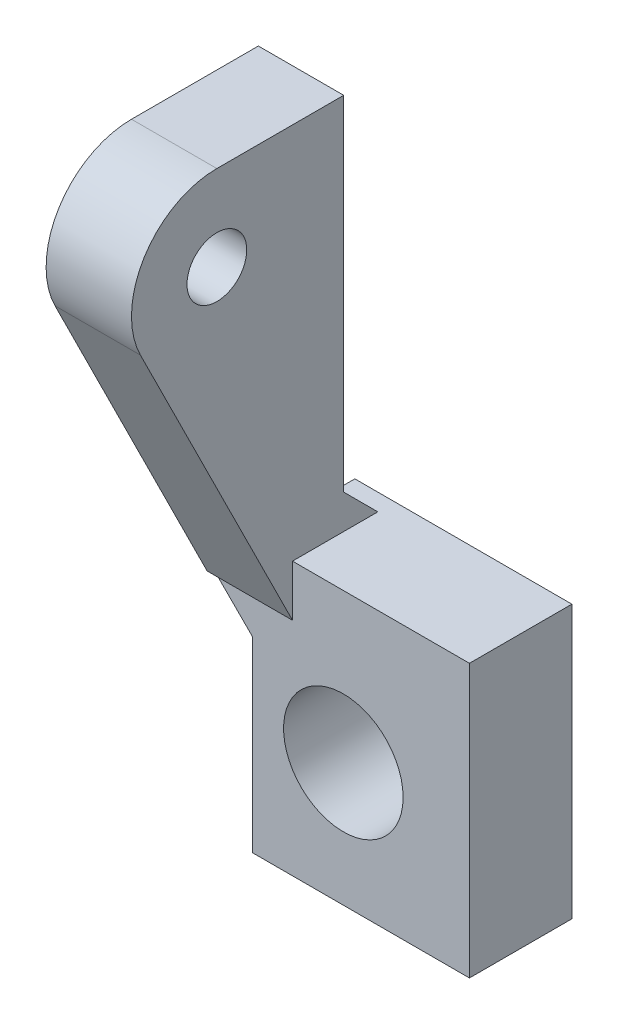
ISO-10303-21;
HEADER;
FILE_DESCRIPTION(('STEP AP214'),'2;1');
FILE_NAME('part.step','',(''),(''),'','','');
FILE_SCHEMA(('AUTOMOTIVE_DESIGN { 1 0 10303 214 1 1 1 1 }'));
ENDSEC;
DATA;
#1=APPLICATION_CONTEXT('core data for automotive mechanical design processes');
#2=APPLICATION_PROTOCOL_DEFINITION('international standard','automotive_design',2000,#1);
#3=PRODUCT_CONTEXT('',#1,'mechanical');
#4=PRODUCT('Part','Part','',(#3));
#5=PRODUCT_RELATED_PRODUCT_CATEGORY('part','',(#4));
#6=PRODUCT_DEFINITION_FORMATION('','',#4);
#7=PRODUCT_DEFINITION_CONTEXT('part definition',#1,'design');
#8=PRODUCT_DEFINITION('design','',#6,#7);
#9=PRODUCT_DEFINITION_SHAPE('','',#8);
#10=(LENGTH_UNIT() NAMED_UNIT(*) SI_UNIT(.MILLI.,.METRE.));
#11=(NAMED_UNIT(*) PLANE_ANGLE_UNIT() SI_UNIT($,.RADIAN.));
#12=(NAMED_UNIT(*) SI_UNIT($,.STERADIAN.) SOLID_ANGLE_UNIT());
#13=UNCERTAINTY_MEASURE_WITH_UNIT(LENGTH_MEASURE(1.E-05),#10,'distance_accuracy_value','');
#14=(GEOMETRIC_REPRESENTATION_CONTEXT(3) GLOBAL_UNCERTAINTY_ASSIGNED_CONTEXT((#13)) GLOBAL_UNIT_ASSIGNED_CONTEXT((#10,
#11,#12)) REPRESENTATION_CONTEXT('',''));
#15=CARTESIAN_POINT('',(0.,0.,0.));
#16=DIRECTION('',(0.,0.,1.));
#17=DIRECTION('',(1.,0.,0.));
#18=AXIS2_PLACEMENT_3D('',#15,#16,#17);
#19=CARTESIAN_POINT('',(0.,0.,47.41148));
#20=DIRECTION('',(0.,0.,-1.));
#21=DIRECTION('',(-1.,0.,0.));
#22=AXIS2_PLACEMENT_3D('',#19,#20,#21);
#23=PLANE('',#22);
#24=CARTESIAN_POINT('',(38.4788523967918,6.56657386274739,47.41148));
#25=DIRECTION('',(0.,0.,1.));
#26=DIRECTION('',(1.,0.,0.));
#27=AXIS2_PLACEMENT_3D('',#24,#25,#26);
#28=CIRCLE('',#27,1.8);
#29=CARTESIAN_POINT('',(40.2788523967918,6.56657386274739,47.41148));
#30=VERTEX_POINT('',#29);
#31=EDGE_CURVE('E221',#30,#30,#28,.T.);
#32=ORIENTED_EDGE('',*,*,#31,.F.);
#33=EDGE_LOOP('',(#32));
#34=FACE_BOUND('',#33,.T.);
#35=CARTESIAN_POINT('',(38.4788523967918,6.56657386274739,47.41148));
#36=DIRECTION('',(0.,0.,1.));
#37=DIRECTION('',(1.,0.,0.));
#38=AXIS2_PLACEMENT_3D('',#35,#36,#37);
#39=CIRCLE('',#38,3.5);
#40=CARTESIAN_POINT('',(41.9788523967918,6.56657386274739,47.41148));
#41=VERTEX_POINT('',#40);
#42=EDGE_CURVE('E279',#41,#41,#39,.T.);
#43=ORIENTED_EDGE('',*,*,#42,.T.);
#44=EDGE_LOOP('',(#43));
#45=FACE_BOUND('',#44,.T.);
#46=ADVANCED_FACE('F39',(#34,#45),#23,.F.);
#47=CARTESIAN_POINT('',(35.4999999999996,12.3085599551472,47.41148));
#48=DIRECTION('',(0.,1.,0.));
#49=DIRECTION('',(-1.,0.,0.));
#50=AXIS2_PLACEMENT_3D('',#47,#48,#49);
#51=PLANE('',#50);
#52=DIRECTION('',(-1.,0.,0.));
#53=VECTOR('',#52,1.);
#54=CARTESIAN_POINT('',(35.4999999999996,12.3085599551472,47.41148));
#55=LINE('',#54,#53);
#56=CARTESIAN_POINT('',(31.1528408173078,12.3085599551471,47.41148));
#57=VERTEX_POINT('',#56);
#58=CARTESIAN_POINT('',(30.4999999999996,12.3085599551471,47.41148));
#59=VERTEX_POINT('',#58);
#60=EDGE_CURVE('E212',#57,#59,#55,.T.);
#61=ORIENTED_EDGE('',*,*,#60,.F.);
#62=DIRECTION('',(0.,0.,1.));
#63=VECTOR('',#62,1.);
#64=CARTESIAN_POINT('',(31.1528408173078,12.3085599551471,52.41148));
#65=LINE('',#64,#63);
#66=CARTESIAN_POINT('',(31.1528408173078,12.3085599551471,52.41148));
#67=VERTEX_POINT('',#66);
#68=EDGE_CURVE('E242',#57,#67,#65,.T.);
#69=ORIENTED_EDGE('',*,*,#68,.T.);
#70=DIRECTION('',(-1.,0.,0.));
#71=VECTOR('',#70,1.);
#72=CARTESIAN_POINT('',(35.4999999999996,12.3085599551472,52.41148));
#73=LINE('',#72,#71);
#74=CARTESIAN_POINT('',(30.4999999999996,12.3085599551471,52.41148));
#75=VERTEX_POINT('',#74);
#76=EDGE_CURVE('E214',#67,#75,#73,.T.);
#77=ORIENTED_EDGE('',*,*,#76,.T.);
#78=DIRECTION('',(0.,0.,-1.));
#79=VECTOR('',#78,1.);
#80=CARTESIAN_POINT('',(30.4999999999996,12.3085599551471,47.41148));
#81=LINE('',#80,#79);
#82=EDGE_CURVE('E189',#75,#59,#81,.T.);
#83=ORIENTED_EDGE('',*,*,#82,.T.);
#84=EDGE_LOOP('',(#61,#69,#77,#83));
#85=FACE_BOUND('',#84,.T.);
#86=ADVANCED_FACE('F247',(#85),#51,.F.);
#87=CARTESIAN_POINT('',(0.,0.,46.41148));
#88=DIRECTION('',(0.,0.,-1.));
#89=DIRECTION('',(-1.,0.,0.));
#90=AXIS2_PLACEMENT_3D('',#87,#88,#89);
#91=PLANE('',#90);
#92=DIRECTION('',(0.,-1.,0.));
#93=VECTOR('',#92,1.);
#94=CARTESIAN_POINT('',(33.1528408173078,-0.654992050270078,46.41148));
#95=LINE('',#94,#93);
#96=CARTESIAN_POINT('',(33.1528408173078,15.3085599551472,46.41148));
#97=VERTEX_POINT('',#96);
#98=CARTESIAN_POINT('',(33.1528408173078,-0.654992050270078,46.41148));
#99=VERTEX_POINT('',#98);
#100=EDGE_CURVE('E150',#97,#99,#95,.T.);
#101=ORIENTED_EDGE('',*,*,#100,.F.);
#102=DIRECTION('',(-1.,0.,0.));
#103=VECTOR('',#102,1.);
#104=CARTESIAN_POINT('',(33.1528408173078,15.3085599551472,46.41148));
#105=LINE('',#104,#103);
#106=CARTESIAN_POINT('',(45.8637656044632,15.3085599551472,46.41148));
#107=VERTEX_POINT('',#106);
#108=EDGE_CURVE('E229',#107,#97,#105,.T.);
#109=ORIENTED_EDGE('',*,*,#108,.F.);
#110=DIRECTION('',(0.,1.,0.));
#111=VECTOR('',#110,1.);
#112=CARTESIAN_POINT('',(45.8637656044632,-0.654992050270078,46.41148));
#113=LINE('',#112,#111);
#114=CARTESIAN_POINT('',(45.8637656044632,-0.654992050270078,46.41148));
#115=VERTEX_POINT('',#114);
#116=EDGE_CURVE('E233',#115,#107,#113,.T.);
#117=ORIENTED_EDGE('',*,*,#116,.F.);
#118=DIRECTION('',(1.,0.,0.));
#119=VECTOR('',#118,1.);
#120=CARTESIAN_POINT('',(33.1528408173078,-0.654992050270078,46.41148));
#121=LINE('',#120,#119);
#122=EDGE_CURVE('E231',#99,#115,#121,.T.);
#123=ORIENTED_EDGE('',*,*,#122,.F.);
#124=EDGE_LOOP('',(#101,#109,#117,#123));
#125=FACE_BOUND('',#124,.T.);
#126=CARTESIAN_POINT('',(38.4788523967918,6.56657386274739,46.41148));
#127=DIRECTION('',(0.,0.,1.));
#128=DIRECTION('',(1.,0.,0.));
#129=AXIS2_PLACEMENT_3D('',#126,#127,#128);
#130=CIRCLE('',#129,1.8);
#131=CARTESIAN_POINT('',(40.2788523967918,6.56657386274739,46.41148));
#132=VERTEX_POINT('',#131);
#133=EDGE_CURVE('E220',#132,#132,#130,.T.);
#134=ORIENTED_EDGE('',*,*,#133,.T.);
#135=EDGE_LOOP('',(#134));
#136=FACE_BOUND('',#135,.T.);
#137=ADVANCED_FACE('F271',(#125,#136),#91,.T.);
#138=CARTESIAN_POINT('',(33.1528408173078,-0.654992050270078,47.41148));
#139=DIRECTION('',(1.,0.,0.));
#140=DIRECTION('',(0.,0.,-1.));
#141=AXIS2_PLACEMENT_3D('',#138,#139,#140);
#142=PLANE('',#141);
#143=DIRECTION('',(0.,-1.,0.));
#144=VECTOR('',#143,1.);
#145=CARTESIAN_POINT('',(33.1528408173078,12.3085599551471,52.41148));
#146=LINE('',#145,#144);
#147=CARTESIAN_POINT('',(33.1528408173078,10.3085599551471,52.41148));
#148=VERTEX_POINT('',#147);
#149=CARTESIAN_POINT('',(33.1528408173078,-0.654992050270078,52.41148));
#150=VERTEX_POINT('',#149);
#151=EDGE_CURVE('E129',#148,#150,#146,.T.);
#152=ORIENTED_EDGE('',*,*,#151,.F.);
#153=DIRECTION('',(0.,0.,-1.));
#154=VECTOR('',#153,1.);
#155=CARTESIAN_POINT('',(33.1528408173078,10.3085599551471,47.41148));
#156=LINE('',#155,#154);
#157=CARTESIAN_POINT('',(33.1528408173078,10.3085599551471,47.41148));
#158=VERTEX_POINT('',#157);
#159=EDGE_CURVE('E152',#148,#158,#156,.T.);
#160=ORIENTED_EDGE('',*,*,#159,.T.);
#161=DIRECTION('',(0.,-1.,0.));
#162=VECTOR('',#161,1.);
#163=CARTESIAN_POINT('',(33.1528408173078,-0.654992050270078,47.41148));
#164=LINE('',#163,#162);
#165=CARTESIAN_POINT('',(33.1528408173078,15.3085599551471,47.41148));
#166=VERTEX_POINT('',#165);
#167=EDGE_CURVE('E226',#166,#158,#164,.T.);
#168=ORIENTED_EDGE('',*,*,#167,.F.);
#169=DIRECTION('',(0.,0.,-1.));
#170=VECTOR('',#169,1.);
#171=CARTESIAN_POINT('',(33.1528408173078,15.3085599551472,47.41148));
#172=LINE('',#171,#170);
#173=EDGE_CURVE('E228',#166,#97,#172,.T.);
#174=ORIENTED_EDGE('',*,*,#173,.T.);
#175=ORIENTED_EDGE('',*,*,#100,.T.);
#176=DIRECTION('',(0.,0.,-1.));
#177=VECTOR('',#176,1.);
#178=CARTESIAN_POINT('',(33.1528408173078,-0.654992050270078,47.41148));
#179=LINE('',#178,#177);
#180=EDGE_CURVE('E146',#150,#99,#179,.T.);
#181=ORIENTED_EDGE('',*,*,#180,.F.);
#182=EDGE_LOOP('',(#152,#160,#168,#174,#175,#181));
#183=FACE_BOUND('',#182,.T.);
#184=ADVANCED_FACE('F147',(#183),#142,.F.);
#185=CARTESIAN_POINT('',(33.1528408173078,-0.654992050270078,47.41148));
#186=DIRECTION('',(0.,1.,0.));
#187=DIRECTION('',(0.,0.,1.));
#188=AXIS2_PLACEMENT_3D('',#185,#186,#187);
#189=PLANE('',#188);
#190=ORIENTED_EDGE('',*,*,#122,.T.);
#191=DIRECTION('',(0.,0.,-1.));
#192=VECTOR('',#191,1.);
#193=CARTESIAN_POINT('',(45.8637656044632,-0.654992050270078,47.41148));
#194=LINE('',#193,#192);
#195=CARTESIAN_POINT('',(45.8637656044632,-0.654992050270078,52.41148));
#196=VERTEX_POINT('',#195);
#197=EDGE_CURVE('E153',#196,#115,#194,.T.);
#198=ORIENTED_EDGE('',*,*,#197,.F.);
#199=DIRECTION('',(1.,0.,0.));
#200=VECTOR('',#199,1.);
#201=CARTESIAN_POINT('',(33.1528408173078,-0.654992050270078,52.41148));
#202=LINE('',#201,#200);
#203=EDGE_CURVE('E136',#150,#196,#202,.T.);
#204=ORIENTED_EDGE('',*,*,#203,.F.);
#205=ORIENTED_EDGE('',*,*,#180,.T.);
#206=EDGE_LOOP('',(#190,#198,#204,#205));
#207=FACE_BOUND('',#206,.T.);
#208=ADVANCED_FACE('F155',(#207),#189,.F.);
#209=CARTESIAN_POINT('',(45.8637656044632,-0.654992050270078,47.41148));
#210=DIRECTION('',(-1.,0.,0.));
#211=DIRECTION('',(0.,0.,1.));
#212=AXIS2_PLACEMENT_3D('',#209,#210,#211);
#213=PLANE('',#212);
#214=ORIENTED_EDGE('',*,*,#116,.T.);
#215=DIRECTION('',(0.,0.,-1.));
#216=VECTOR('',#215,1.);
#217=CARTESIAN_POINT('',(45.8637656044632,15.3085599551472,47.41148));
#218=LINE('',#217,#216);
#219=CARTESIAN_POINT('',(45.8637656044632,15.3085599551472,52.41148));
#220=VERTEX_POINT('',#219);
#221=EDGE_CURVE('E237',#220,#107,#218,.T.);
#222=ORIENTED_EDGE('',*,*,#221,.F.);
#223=DIRECTION('',(0.,1.,0.));
#224=VECTOR('',#223,1.);
#225=CARTESIAN_POINT('',(45.8637656044632,-0.654992050270078,52.41148));
#226=LINE('',#225,#224);
#227=EDGE_CURVE('E157',#196,#220,#226,.T.);
#228=ORIENTED_EDGE('',*,*,#227,.F.);
#229=ORIENTED_EDGE('',*,*,#197,.T.);
#230=EDGE_LOOP('',(#214,#222,#228,#229));
#231=FACE_BOUND('',#230,.T.);
#232=ADVANCED_FACE('F274',(#231),#213,.F.);
#233=CARTESIAN_POINT('',(33.1528408173078,15.3085599551472,47.41148));
#234=DIRECTION('',(0.,-1.,0.));
#235=DIRECTION('',(0.,0.,-1.));
#236=AXIS2_PLACEMENT_3D('',#233,#234,#235);
#237=PLANE('',#236);
#238=ORIENTED_EDGE('',*,*,#108,.T.);
#239=ORIENTED_EDGE('',*,*,#173,.F.);
#240=DIRECTION('',(-1.,0.,0.));
#241=VECTOR('',#240,1.);
#242=CARTESIAN_POINT('',(35.4999999999996,15.3085599551472,47.41148));
#243=LINE('',#242,#241);
#244=CARTESIAN_POINT('',(35.4999999999996,15.3085599551472,47.41148));
#245=VERTEX_POINT('',#244);
#246=EDGE_CURVE('E209',#245,#166,#243,.T.);
#247=ORIENTED_EDGE('',*,*,#246,.F.);
#248=DIRECTION('',(0.,0.,-1.));
#249=VECTOR('',#248,1.);
#250=CARTESIAN_POINT('',(35.4999999999996,15.3085599551472,52.41148));
#251=LINE('',#250,#249);
#252=CARTESIAN_POINT('',(35.4999999999996,15.3085599551472,52.41148));
#253=VERTEX_POINT('',#252);
#254=EDGE_CURVE('E159',#253,#245,#251,.T.);
#255=ORIENTED_EDGE('',*,*,#254,.F.);
#256=DIRECTION('',(-1.,0.,0.));
#257=VECTOR('',#256,1.);
#258=CARTESIAN_POINT('',(45.8637656044632,15.3085599551472,52.41148));
#259=LINE('',#258,#257);
#260=EDGE_CURVE('E275',#220,#253,#259,.T.);
#261=ORIENTED_EDGE('',*,*,#260,.F.);
#262=ORIENTED_EDGE('',*,*,#221,.T.);
#263=EDGE_LOOP('',(#238,#239,#247,#255,#261,#262));
#264=FACE_BOUND('',#263,.T.);
#265=ADVANCED_FACE('F266',(#264),#237,.F.);
#266=CARTESIAN_POINT('',(38.4788523967918,6.56657386274739,47.41148));
#267=DIRECTION('',(0.,0.,-1.));
#268=DIRECTION('',(-1.,0.,0.));
#269=AXIS2_PLACEMENT_3D('',#266,#267,#268);
#270=CYLINDRICAL_SURFACE('',#269,1.8);
#271=ORIENTED_EDGE('',*,*,#31,.T.);
#272=EDGE_LOOP('',(#271));
#273=FACE_BOUND('',#272,.T.);
#274=ORIENTED_EDGE('',*,*,#133,.F.);
#275=EDGE_LOOP('',(#274));
#276=FACE_BOUND('',#275,.T.);
#277=ADVANCED_FACE('F306',(#273,#276),#270,.F.);
#278=CARTESIAN_POINT('',(35.4999999999996,15.3085599551472,47.41148));
#279=DIRECTION('',(0.,0.,1.));
#280=DIRECTION('',(1.,0.,0.));
#281=AXIS2_PLACEMENT_3D('',#278,#279,#280);
#282=PLANE('',#281);
#283=CARTESIAN_POINT('',(30.4999999999996,15.3085599551471,47.41148));
#284=VERTEX_POINT('',#283);
#285=EDGE_CURVE('E208',#166,#284,#243,.T.);
#286=ORIENTED_EDGE('',*,*,#285,.F.);
#287=ORIENTED_EDGE('',*,*,#167,.T.);
#288=DIRECTION('',(0.707106781186544,-0.707106781186551,0.));
#289=VECTOR('',#288,1.);
#290=CARTESIAN_POINT('',(31.8264204086537,11.6349803638013,47.41148));
#291=LINE('',#290,#289);
#292=EDGE_CURVE('E49',#158,#57,#291,.F.);
#293=ORIENTED_EDGE('',*,*,#292,.T.);
#294=ORIENTED_EDGE('',*,*,#60,.T.);
#295=DIRECTION('',(0.,1.,0.));
#296=VECTOR('',#295,1.);
#297=CARTESIAN_POINT('',(30.4999999999996,15.3085599551471,47.41148));
#298=LINE('',#297,#296);
#299=EDGE_CURVE('E192',#59,#284,#298,.T.);
#300=ORIENTED_EDGE('',*,*,#299,.T.);
#301=EDGE_LOOP('',(#286,#287,#293,#294,#300));
#302=FACE_BOUND('',#301,.T.);
#303=ADVANCED_FACE('F256',(#302),#282,.F.);
#304=CARTESIAN_POINT('',(35.4999999999996,32.437587440531,56.8415291073847));
#305=DIRECTION('',(1.,0.,0.));
#306=DIRECTION('',(0.,0.,-1.));
#307=AXIS2_PLACEMENT_3D('',#304,#305,#306);
#308=PLANE('',#307);
#309=DIRECTION('',(0.,-1.,0.));
#310=VECTOR('',#309,1.);
#311=CARTESIAN_POINT('',(35.4999999999996,15.3085599551472,52.41148));
#312=LINE('',#311,#310);
#313=CARTESIAN_POINT('',(35.4999999999996,12.3085599551472,52.41148));
#314=VERTEX_POINT('',#313);
#315=EDGE_CURVE('E142',#253,#314,#312,.T.);
#316=ORIENTED_EDGE('',*,*,#315,.F.);
#317=ORIENTED_EDGE('',*,*,#254,.T.);
#318=DIRECTION('',(0.,0.707106781186547,0.707106781186548));
#319=VECTOR('',#318,1.);
#320=CARTESIAN_POINT('',(35.4999999999996,17.3085599551471,49.41148));
#321=LINE('',#320,#319);
#322=CARTESIAN_POINT('',(35.4999999999996,17.3085599551471,49.41148));
#323=VERTEX_POINT('',#322);
#324=EDGE_CURVE('E177',#245,#323,#321,.T.);
#325=ORIENTED_EDGE('',*,*,#324,.T.);
#326=DIRECTION('',(0.,1.,0.));
#327=VECTOR('',#326,1.);
#328=CARTESIAN_POINT('',(35.4999999999996,37.437587440531,49.41148));
#329=LINE('',#328,#327);
#330=CARTESIAN_POINT('',(35.4999999999996,37.437587440531,49.41148));
#331=VERTEX_POINT('',#330);
#332=EDGE_CURVE('E179',#323,#331,#329,.T.);
#333=ORIENTED_EDGE('',*,*,#332,.T.);
#334=DIRECTION('',(0.,0.,1.));
#335=VECTOR('',#334,1.);
#336=CARTESIAN_POINT('',(35.4999999999996,37.437587440531,56.8415291073847));
#337=LINE('',#336,#335);
#338=CARTESIAN_POINT('',(35.4999999999996,37.437587440531,56.8415291073847));
#339=VERTEX_POINT('',#338);
#340=EDGE_CURVE('E181',#331,#339,#337,.T.);
#341=ORIENTED_EDGE('',*,*,#340,.T.);
#342=CARTESIAN_POINT('',(35.4999999999996,32.437587440531,56.8415291073847));
#343=DIRECTION('',(1.,0.,0.));
#344=DIRECTION('',(0.,0.,-1.));
#345=AXIS2_PLACEMENT_3D('',#342,#343,#344);
#346=CIRCLE('',#345,4.99999999999999);
#347=CARTESIAN_POINT('',(35.4999999999996,30.2103871706139,61.3180879372987));
#348=VERTEX_POINT('',#347);
#349=EDGE_CURVE('E171',#339,#348,#346,.T.);
#350=ORIENTED_EDGE('',*,*,#349,.T.);
#351=DIRECTION('',(0.,-0.895311765982805,-0.445440053983419));
#352=VECTOR('',#351,1.);
#353=CARTESIAN_POINT('',(35.4999999999996,12.3085599551472,52.41148));
#354=LINE('',#353,#352);
#355=EDGE_CURVE('E174',#348,#314,#354,.T.);
#356=ORIENTED_EDGE('',*,*,#355,.T.);
#357=EDGE_LOOP('',(#316,#317,#325,#333,#341,#350,#356));
#358=FACE_BOUND('',#357,.T.);
#359=CARTESIAN_POINT('',(35.4999999999996,32.437587440531,56.8415291073847));
#360=DIRECTION('',(1.,0.,0.));
#361=DIRECTION('',(0.,0.,-1.));
#362=AXIS2_PLACEMENT_3D('',#359,#360,#361);
#363=CIRCLE('',#362,1.75);
#364=CARTESIAN_POINT('',(35.4999999999996,32.437587440531,55.0915291073847));
#365=VERTEX_POINT('',#364);
#366=EDGE_CURVE('E165',#365,#365,#363,.T.);
#367=ORIENTED_EDGE('',*,*,#366,.F.);
#368=EDGE_LOOP('',(#367));
#369=FACE_BOUND('',#368,.T.);
#370=ADVANCED_FACE('F347',(#358,#369),#308,.T.);
#371=CARTESIAN_POINT('',(30.4999999999996,32.437587440531,56.8415291073847));
#372=DIRECTION('',(1.,0.,0.));
#373=DIRECTION('',(0.,0.,-1.));
#374=AXIS2_PLACEMENT_3D('',#371,#372,#373);
#375=PLANE('',#374);
#376=CARTESIAN_POINT('',(30.4999999999996,32.437587440531,56.8415291073847));
#377=DIRECTION('',(1.,0.,0.));
#378=DIRECTION('',(0.,0.,-1.));
#379=AXIS2_PLACEMENT_3D('',#376,#377,#378);
#380=CIRCLE('',#379,4.99999999999999);
#381=CARTESIAN_POINT('',(30.4999999999996,37.437587440531,56.8415291073847));
#382=VERTEX_POINT('',#381);
#383=CARTESIAN_POINT('',(30.4999999999996,30.2103871706139,61.3180879372987));
#384=VERTEX_POINT('',#383);
#385=EDGE_CURVE('E168',#382,#384,#380,.T.);
#386=ORIENTED_EDGE('',*,*,#385,.F.);
#387=DIRECTION('',(0.,0.,1.));
#388=VECTOR('',#387,1.);
#389=CARTESIAN_POINT('',(30.4999999999996,37.437587440531,56.8415291073847));
#390=LINE('',#389,#388);
#391=CARTESIAN_POINT('',(30.4999999999996,37.437587440531,49.41148));
#392=VERTEX_POINT('',#391);
#393=EDGE_CURVE('E175',#392,#382,#390,.T.);
#394=ORIENTED_EDGE('',*,*,#393,.F.);
#395=DIRECTION('',(0.,1.,0.));
#396=VECTOR('',#395,1.);
#397=CARTESIAN_POINT('',(30.4999999999996,37.437587440531,49.41148));
#398=LINE('',#397,#396);
#399=CARTESIAN_POINT('',(30.4999999999996,17.3085599551471,49.41148));
#400=VERTEX_POINT('',#399);
#401=EDGE_CURVE('E197',#400,#392,#398,.T.);
#402=ORIENTED_EDGE('',*,*,#401,.F.);
#403=DIRECTION('',(0.,0.707106781186547,0.707106781186548));
#404=VECTOR('',#403,1.);
#405=CARTESIAN_POINT('',(30.4999999999996,17.3085599551471,49.41148));
#406=LINE('',#405,#404);
#407=EDGE_CURVE('E195',#284,#400,#406,.T.);
#408=ORIENTED_EDGE('',*,*,#407,.F.);
#409=ORIENTED_EDGE('',*,*,#299,.F.);
#410=ORIENTED_EDGE('',*,*,#82,.F.);
#411=DIRECTION('',(0.,-0.895311765982805,-0.445440053983419));
#412=VECTOR('',#411,1.);
#413=CARTESIAN_POINT('',(30.4999999999996,12.3085599551471,52.41148));
#414=LINE('',#413,#412);
#415=EDGE_CURVE('E186',#384,#75,#414,.T.);
#416=ORIENTED_EDGE('',*,*,#415,.F.);
#417=EDGE_LOOP('',(#386,#394,#402,#408,#409,#410,#416));
#418=FACE_BOUND('',#417,.T.);
#419=CARTESIAN_POINT('',(30.4999999999996,32.437587440531,56.8415291073847));
#420=DIRECTION('',(1.,0.,0.));
#421=DIRECTION('',(0.,0.,-1.));
#422=AXIS2_PLACEMENT_3D('',#419,#420,#421);
#423=CIRCLE('',#422,1.75);
#424=CARTESIAN_POINT('',(30.4999999999996,32.437587440531,55.0915291073847));
#425=VERTEX_POINT('',#424);
#426=EDGE_CURVE('E164',#425,#425,#423,.T.);
#427=ORIENTED_EDGE('',*,*,#426,.T.);
#428=EDGE_LOOP('',(#427));
#429=FACE_BOUND('',#428,.T.);
#430=ADVANCED_FACE('F354',(#418,#429),#375,.F.);
#431=CARTESIAN_POINT('',(35.4999999999996,32.437587440531,56.8415291073847));
#432=DIRECTION('',(-1.,0.,0.));
#433=DIRECTION('',(0.,0.,1.));
#434=AXIS2_PLACEMENT_3D('',#431,#432,#433);
#435=CYLINDRICAL_SURFACE('',#434,4.99999999999999);
#436=ORIENTED_EDGE('',*,*,#385,.T.);
#437=DIRECTION('',(-1.,0.,0.));
#438=VECTOR('',#437,1.);
#439=CARTESIAN_POINT('',(35.4999999999996,30.2103871706139,61.3180879372987));
#440=LINE('',#439,#438);
#441=EDGE_CURVE('E217',#348,#384,#440,.T.);
#442=ORIENTED_EDGE('',*,*,#441,.F.);
#443=ORIENTED_EDGE('',*,*,#349,.F.);
#444=DIRECTION('',(-1.,0.,0.));
#445=VECTOR('',#444,1.);
#446=CARTESIAN_POINT('',(35.4999999999996,37.437587440531,56.8415291073847));
#447=LINE('',#446,#445);
#448=EDGE_CURVE('E183',#339,#382,#447,.T.);
#449=ORIENTED_EDGE('',*,*,#448,.T.);
#450=EDGE_LOOP('',(#436,#442,#443,#449));
#451=FACE_BOUND('',#450,.T.);
#452=ADVANCED_FACE('F362',(#451),#435,.T.);
#453=CARTESIAN_POINT('',(35.4999999999996,12.3085599551472,52.41148));
#454=DIRECTION('',(0.,0.445440053983419,-0.895311765982805));
#455=DIRECTION('',(0.,0.895311765982805,0.445440053983419));
#456=AXIS2_PLACEMENT_3D('',#453,#454,#455);
#457=PLANE('',#456);
#458=ORIENTED_EDGE('',*,*,#415,.T.);
#459=ORIENTED_EDGE('',*,*,#76,.F.);
#460=EDGE_CURVE('E215',#314,#67,#73,.T.);
#461=ORIENTED_EDGE('',*,*,#460,.F.);
#462=ORIENTED_EDGE('',*,*,#355,.F.);
#463=ORIENTED_EDGE('',*,*,#441,.T.);
#464=EDGE_LOOP('',(#458,#459,#461,#462,#463));
#465=FACE_BOUND('',#464,.T.);
#466=ADVANCED_FACE('F251',(#465),#457,.F.);
#467=CARTESIAN_POINT('',(35.4999999999996,17.3085599551471,49.41148));
#468=DIRECTION('',(0.,-0.707106781186548,0.707106781186547));
#469=DIRECTION('',(0.,-0.707106781186547,-0.707106781186548));
#470=AXIS2_PLACEMENT_3D('',#467,#468,#469);
#471=PLANE('',#470);
#472=ORIENTED_EDGE('',*,*,#407,.T.);
#473=DIRECTION('',(-1.,0.,0.));
#474=VECTOR('',#473,1.);
#475=CARTESIAN_POINT('',(35.4999999999996,17.3085599551471,49.41148));
#476=LINE('',#475,#474);
#477=EDGE_CURVE('E205',#323,#400,#476,.T.);
#478=ORIENTED_EDGE('',*,*,#477,.F.);
#479=ORIENTED_EDGE('',*,*,#324,.F.);
#480=ORIENTED_EDGE('',*,*,#246,.T.);
#481=ORIENTED_EDGE('',*,*,#285,.T.);
#482=EDGE_LOOP('',(#472,#478,#479,#480,#481));
#483=FACE_BOUND('',#482,.T.);
#484=ADVANCED_FACE('F262',(#483),#471,.F.);
#485=CARTESIAN_POINT('',(35.4999999999996,37.437587440531,49.41148));
#486=DIRECTION('',(0.,0.,1.));
#487=DIRECTION('',(1.,0.,0.));
#488=AXIS2_PLACEMENT_3D('',#485,#486,#487);
#489=PLANE('',#488);
#490=ORIENTED_EDGE('',*,*,#401,.T.);
#491=DIRECTION('',(-1.,0.,0.));
#492=VECTOR('',#491,1.);
#493=CARTESIAN_POINT('',(35.4999999999996,37.437587440531,49.41148));
#494=LINE('',#493,#492);
#495=EDGE_CURVE('E202',#331,#392,#494,.T.);
#496=ORIENTED_EDGE('',*,*,#495,.F.);
#497=ORIENTED_EDGE('',*,*,#332,.F.);
#498=ORIENTED_EDGE('',*,*,#477,.T.);
#499=EDGE_LOOP('',(#490,#496,#497,#498));
#500=FACE_BOUND('',#499,.T.);
#501=ADVANCED_FACE('F382',(#500),#489,.F.);
#502=CARTESIAN_POINT('',(35.4999999999996,37.437587440531,56.8415291073847));
#503=DIRECTION('',(0.,-1.,0.));
#504=DIRECTION('',(1.,0.,0.));
#505=AXIS2_PLACEMENT_3D('',#502,#503,#504);
#506=PLANE('',#505);
#507=ORIENTED_EDGE('',*,*,#393,.T.);
#508=ORIENTED_EDGE('',*,*,#448,.F.);
#509=ORIENTED_EDGE('',*,*,#340,.F.);
#510=ORIENTED_EDGE('',*,*,#495,.T.);
#511=EDGE_LOOP('',(#507,#508,#509,#510));
#512=FACE_BOUND('',#511,.T.);
#513=ADVANCED_FACE('F388',(#512),#506,.F.);
#514=CARTESIAN_POINT('',(35.4999999999996,32.437587440531,56.8415291073847));
#515=DIRECTION('',(-1.,0.,0.));
#516=DIRECTION('',(0.,0.,1.));
#517=AXIS2_PLACEMENT_3D('',#514,#515,#516);
#518=CYLINDRICAL_SURFACE('',#517,1.75);
#519=ORIENTED_EDGE('',*,*,#366,.T.);
#520=EDGE_LOOP('',(#519));
#521=FACE_BOUND('',#520,.T.);
#522=ORIENTED_EDGE('',*,*,#426,.F.);
#523=EDGE_LOOP('',(#522));
#524=FACE_BOUND('',#523,.T.);
#525=ADVANCED_FACE('F294',(#521,#524),#518,.F.);
#526=CARTESIAN_POINT('',(0.,0.,52.41148));
#527=DIRECTION('',(0.,0.,1.));
#528=DIRECTION('',(1.,0.,0.));
#529=AXIS2_PLACEMENT_3D('',#526,#527,#528);
#530=PLANE('',#529);
#531=ORIENTED_EDGE('',*,*,#260,.T.);
#532=ORIENTED_EDGE('',*,*,#315,.T.);
#533=ORIENTED_EDGE('',*,*,#460,.T.);
#534=DIRECTION('',(-0.707106781186544,0.707106781186551,0.));
#535=VECTOR('',#534,1.);
#536=CARTESIAN_POINT('',(33.1528408173078,10.3085599551471,52.41148));
#537=LINE('',#536,#535);
#538=EDGE_CURVE('E11',#67,#148,#537,.F.);
#539=ORIENTED_EDGE('',*,*,#538,.T.);
#540=ORIENTED_EDGE('',*,*,#151,.T.);
#541=ORIENTED_EDGE('',*,*,#203,.T.);
#542=ORIENTED_EDGE('',*,*,#227,.T.);
#543=EDGE_LOOP('',(#531,#532,#533,#539,#540,#541,#542));
#544=FACE_BOUND('',#543,.T.);
#545=CARTESIAN_POINT('',(38.4788523967918,6.56657386274739,52.41148));
#546=DIRECTION('',(0.,0.,1.));
#547=DIRECTION('',(1.,0.,0.));
#548=AXIS2_PLACEMENT_3D('',#545,#546,#547);
#549=CIRCLE('',#548,3.5);
#550=CARTESIAN_POINT('',(41.9788523967918,6.56657386274739,52.41148));
#551=VERTEX_POINT('',#550);
#552=EDGE_CURVE('E276',#551,#551,#549,.T.);
#553=ORIENTED_EDGE('',*,*,#552,.F.);
#554=EDGE_LOOP('',(#553));
#555=FACE_BOUND('',#554,.T.);
#556=ADVANCED_FACE('F132',(#544,#555),#530,.T.);
#557=CARTESIAN_POINT('',(38.4788523967918,6.56657386274739,52.41148));
#558=DIRECTION('',(0.,0.,-1.));
#559=DIRECTION('',(-1.,0.,0.));
#560=AXIS2_PLACEMENT_3D('',#557,#558,#559);
#561=CYLINDRICAL_SURFACE('',#560,3.5);
#562=ORIENTED_EDGE('',*,*,#552,.T.);
#563=EDGE_LOOP('',(#562));
#564=FACE_BOUND('',#563,.T.);
#565=ORIENTED_EDGE('',*,*,#42,.F.);
#566=EDGE_LOOP('',(#565));
#567=FACE_BOUND('',#566,.T.);
#568=ADVANCED_FACE('F286',(#564,#567),#561,.F.);
#569=CARTESIAN_POINT('',(33.1528408173078,10.3085599551471,47.41148));
#570=DIRECTION('',(-0.707106781186551,-0.707106781186544,0.));
#571=DIRECTION('',(0.,0.,1.));
#572=AXIS2_PLACEMENT_3D('',#569,#570,#571);
#573=PLANE('',#572);
#574=ORIENTED_EDGE('',*,*,#538,.F.);
#575=ORIENTED_EDGE('',*,*,#68,.F.);
#576=ORIENTED_EDGE('',*,*,#292,.F.);
#577=ORIENTED_EDGE('',*,*,#159,.F.);
#578=EDGE_LOOP('',(#574,#575,#576,#577));
#579=FACE_BOUND('',#578,.T.);
#580=ADVANCED_FACE('F42',(#579),#573,.T.);
#581=CLOSED_SHELL('',(#46,#86,#137,#184,#208,#232,#265,#277,#303,#370,#430,#452,#466,#484,#501,
#513,#525,#556,#568,#580));
#582=MANIFOLD_SOLID_BREP('B2',#581);
#583=ADVANCED_BREP_SHAPE_REPRESENTATION('',(#18,#582),#14);
#584=SHAPE_DEFINITION_REPRESENTATION(#9,#583);
ENDSEC;
END-ISO-10303-21;
